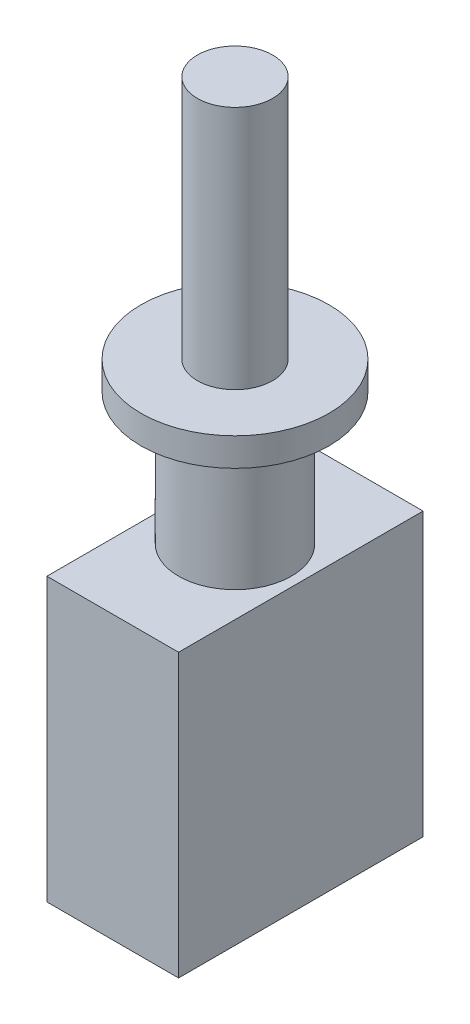
ISO-10303-21;
HEADER;
FILE_DESCRIPTION(('STEP AP214'),'2;1');
FILE_NAME('part.step','',(''),(''),'','','');
FILE_SCHEMA(('AUTOMOTIVE_DESIGN { 1 0 10303 214 1 1 1 1 }'));
ENDSEC;
DATA;
#1=APPLICATION_CONTEXT('core data for automotive mechanical design processes');
#2=APPLICATION_PROTOCOL_DEFINITION('international standard','automotive_design',2000,#1);
#3=PRODUCT_CONTEXT('',#1,'mechanical');
#4=PRODUCT('Part','Part','',(#3));
#5=PRODUCT_RELATED_PRODUCT_CATEGORY('part','',(#4));
#6=PRODUCT_DEFINITION_FORMATION('','',#4);
#7=PRODUCT_DEFINITION_CONTEXT('part definition',#1,'design');
#8=PRODUCT_DEFINITION('design','',#6,#7);
#9=PRODUCT_DEFINITION_SHAPE('','',#8);
#10=(LENGTH_UNIT() NAMED_UNIT(*) SI_UNIT(.MILLI.,.METRE.));
#11=(NAMED_UNIT(*) PLANE_ANGLE_UNIT() SI_UNIT($,.RADIAN.));
#12=(NAMED_UNIT(*) SI_UNIT($,.STERADIAN.) SOLID_ANGLE_UNIT());
#13=UNCERTAINTY_MEASURE_WITH_UNIT(LENGTH_MEASURE(1.E-05),#10,'distance_accuracy_value','');
#14=(GEOMETRIC_REPRESENTATION_CONTEXT(3) GLOBAL_UNCERTAINTY_ASSIGNED_CONTEXT((#13)) GLOBAL_UNIT_ASSIGNED_CONTEXT((#10,
#11,#12)) REPRESENTATION_CONTEXT('',''));
#15=CARTESIAN_POINT('',(0.,0.,0.));
#16=DIRECTION('',(0.,0.,1.));
#17=DIRECTION('',(1.,0.,0.));
#18=AXIS2_PLACEMENT_3D('',#15,#16,#17);
#19=CARTESIAN_POINT('',(0.,23.5,0.));
#20=DIRECTION('',(0.,1.,0.));
#21=DIRECTION('',(0.,0.,1.));
#22=AXIS2_PLACEMENT_3D('',#19,#20,#21);
#23=PLANE('',#22);
#24=CARTESIAN_POINT('',(0.,23.5,0.));
#25=DIRECTION('',(0.,1.,0.));
#26=DIRECTION('',(0.,0.,1.));
#27=AXIS2_PLACEMENT_3D('',#24,#25,#26);
#28=CIRCLE('',#27,5.);
#29=CARTESIAN_POINT('',(0.,23.5,5.));
#30=VERTEX_POINT('',#29);
#31=EDGE_CURVE('E151',#30,#30,#28,.T.);
#32=ORIENTED_EDGE('',*,*,#31,.T.);
#33=EDGE_LOOP('',(#32));
#34=FACE_BOUND('',#33,.T.);
#35=CARTESIAN_POINT('',(0.,23.5,0.));
#36=DIRECTION('',(0.,1.,0.));
#37=DIRECTION('',(0.,0.,1.));
#38=AXIS2_PLACEMENT_3D('',#35,#36,#37);
#39=CIRCLE('',#38,2.);
#40=CARTESIAN_POINT('',(0.,23.5,-2.));
#41=VERTEX_POINT('',#40);
#42=EDGE_CURVE('E159',#41,#41,#39,.T.);
#43=ORIENTED_EDGE('',*,*,#42,.F.);
#44=EDGE_LOOP('',(#43));
#45=FACE_BOUND('',#44,.T.);
#46=ADVANCED_FACE('F33',(#34,#45),#23,.T.);
#47=CARTESIAN_POINT('',(-3.5,15.,-6.5));
#48=DIRECTION('',(0.,-1.,0.));
#49=DIRECTION('',(0.,0.,-1.));
#50=AXIS2_PLACEMENT_3D('',#47,#48,#49);
#51=PLANE('',#50);
#52=DIRECTION('',(0.,0.,1.));
#53=VECTOR('',#52,1.);
#54=CARTESIAN_POINT('',(-3.5,15.,6.5));
#55=LINE('',#54,#53);
#56=CARTESIAN_POINT('',(-3.5,15.,-6.5));
#57=VERTEX_POINT('',#56);
#58=CARTESIAN_POINT('',(-3.5,15.,6.5));
#59=VERTEX_POINT('',#58);
#60=EDGE_CURVE('E87',#57,#59,#55,.T.);
#61=ORIENTED_EDGE('',*,*,#60,.T.);
#62=DIRECTION('',(1.,0.,0.));
#63=VECTOR('',#62,1.);
#64=CARTESIAN_POINT('',(-3.5,15.,6.5));
#65=LINE('',#64,#63);
#66=CARTESIAN_POINT('',(3.5,15.,6.5));
#67=VERTEX_POINT('',#66);
#68=EDGE_CURVE('E81',#59,#67,#65,.T.);
#69=ORIENTED_EDGE('',*,*,#68,.T.);
#70=DIRECTION('',(0.,0.,-1.));
#71=VECTOR('',#70,1.);
#72=CARTESIAN_POINT('',(3.5,15.,6.5));
#73=LINE('',#72,#71);
#74=CARTESIAN_POINT('',(3.5,15.,-6.5));
#75=VERTEX_POINT('',#74);
#76=EDGE_CURVE('E85',#67,#75,#73,.T.);
#77=ORIENTED_EDGE('',*,*,#76,.T.);
#78=DIRECTION('',(-1.,0.,0.));
#79=VECTOR('',#78,1.);
#80=CARTESIAN_POINT('',(-3.5,15.,-6.5));
#81=LINE('',#80,#79);
#82=EDGE_CURVE('E50',#75,#57,#81,.T.);
#83=ORIENTED_EDGE('',*,*,#82,.T.);
#84=EDGE_LOOP('',(#61,#69,#77,#83));
#85=FACE_BOUND('',#84,.T.);
#86=CARTESIAN_POINT('',(0.,15.,0.));
#87=DIRECTION('',(0.,-1.,0.));
#88=DIRECTION('',(0.,0.,-1.));
#89=AXIS2_PLACEMENT_3D('',#86,#87,#88);
#90=CIRCLE('',#89,3.);
#91=CARTESIAN_POINT('',(0.,15.,-3.));
#92=VERTEX_POINT('',#91);
#93=EDGE_CURVE('E11',#92,#92,#90,.F.);
#94=ORIENTED_EDGE('',*,*,#93,.F.);
#95=EDGE_LOOP('',(#94));
#96=FACE_BOUND('',#95,.T.);
#97=ADVANCED_FACE('F82',(#85,#96),#51,.F.);
#98=CARTESIAN_POINT('',(-3.5,15.,6.5));
#99=DIRECTION('',(1.,0.,0.));
#100=DIRECTION('',(0.,0.,-1.));
#101=AXIS2_PLACEMENT_3D('',#98,#99,#100);
#102=PLANE('',#101);
#103=DIRECTION('',(0.,0.,1.));
#104=VECTOR('',#103,1.);
#105=CARTESIAN_POINT('',(-3.5,0.,6.5));
#106=LINE('',#105,#104);
#107=CARTESIAN_POINT('',(-3.5,0.,-6.5));
#108=VERTEX_POINT('',#107);
#109=CARTESIAN_POINT('',(-3.5,0.,6.5));
#110=VERTEX_POINT('',#109);
#111=EDGE_CURVE('E101',#108,#110,#106,.T.);
#112=ORIENTED_EDGE('',*,*,#111,.T.);
#113=DIRECTION('',(0.,-1.,0.));
#114=VECTOR('',#113,1.);
#115=CARTESIAN_POINT('',(-3.5,15.,6.5));
#116=LINE('',#115,#114);
#117=EDGE_CURVE('E42',#59,#110,#116,.T.);
#118=ORIENTED_EDGE('',*,*,#117,.F.);
#119=ORIENTED_EDGE('',*,*,#60,.F.);
#120=DIRECTION('',(0.,-1.,0.));
#121=VECTOR('',#120,1.);
#122=CARTESIAN_POINT('',(-3.5,15.,-6.5));
#123=LINE('',#122,#121);
#124=EDGE_CURVE('E97',#57,#108,#123,.T.);
#125=ORIENTED_EDGE('',*,*,#124,.T.);
#126=EDGE_LOOP('',(#112,#118,#119,#125));
#127=FACE_BOUND('',#126,.T.);
#128=ADVANCED_FACE('F35',(#127),#102,.F.);
#129=CARTESIAN_POINT('',(-3.5,15.,6.5));
#130=DIRECTION('',(0.,0.,-1.));
#131=DIRECTION('',(-1.,0.,0.));
#132=AXIS2_PLACEMENT_3D('',#129,#130,#131);
#133=PLANE('',#132);
#134=DIRECTION('',(1.,0.,0.));
#135=VECTOR('',#134,1.);
#136=CARTESIAN_POINT('',(-3.5,0.,6.5));
#137=LINE('',#136,#135);
#138=CARTESIAN_POINT('',(3.5,0.,6.5));
#139=VERTEX_POINT('',#138);
#140=EDGE_CURVE('E92',#110,#139,#137,.T.);
#141=ORIENTED_EDGE('',*,*,#140,.T.);
#142=DIRECTION('',(0.,-1.,0.));
#143=VECTOR('',#142,1.);
#144=CARTESIAN_POINT('',(3.5,15.,6.5));
#145=LINE('',#144,#143);
#146=EDGE_CURVE('E90',#67,#139,#145,.T.);
#147=ORIENTED_EDGE('',*,*,#146,.F.);
#148=ORIENTED_EDGE('',*,*,#68,.F.);
#149=ORIENTED_EDGE('',*,*,#117,.T.);
#150=EDGE_LOOP('',(#141,#147,#148,#149));
#151=FACE_BOUND('',#150,.T.);
#152=ADVANCED_FACE('F91',(#151),#133,.F.);
#153=CARTESIAN_POINT('',(3.5,15.,6.5));
#154=DIRECTION('',(-1.,0.,0.));
#155=DIRECTION('',(0.,0.,1.));
#156=AXIS2_PLACEMENT_3D('',#153,#154,#155);
#157=PLANE('',#156);
#158=DIRECTION('',(0.,0.,-1.));
#159=VECTOR('',#158,1.);
#160=CARTESIAN_POINT('',(3.5,0.,6.5));
#161=LINE('',#160,#159);
#162=CARTESIAN_POINT('',(3.5,0.,-6.5));
#163=VERTEX_POINT('',#162);
#164=EDGE_CURVE('E67',#139,#163,#161,.T.);
#165=ORIENTED_EDGE('',*,*,#164,.T.);
#166=DIRECTION('',(0.,-1.,0.));
#167=VECTOR('',#166,1.);
#168=CARTESIAN_POINT('',(3.5,15.,-6.5));
#169=LINE('',#168,#167);
#170=EDGE_CURVE('E93',#75,#163,#169,.T.);
#171=ORIENTED_EDGE('',*,*,#170,.F.);
#172=ORIENTED_EDGE('',*,*,#76,.F.);
#173=ORIENTED_EDGE('',*,*,#146,.T.);
#174=EDGE_LOOP('',(#165,#171,#172,#173));
#175=FACE_BOUND('',#174,.T.);
#176=ADVANCED_FACE('F95',(#175),#157,.F.);
#177=CARTESIAN_POINT('',(-3.5,15.,-6.5));
#178=DIRECTION('',(0.,0.,1.));
#179=DIRECTION('',(1.,0.,0.));
#180=AXIS2_PLACEMENT_3D('',#177,#178,#179);
#181=PLANE('',#180);
#182=DIRECTION('',(-1.,0.,0.));
#183=VECTOR('',#182,1.);
#184=CARTESIAN_POINT('',(-3.5,0.,-6.5));
#185=LINE('',#184,#183);
#186=EDGE_CURVE('E73',#163,#108,#185,.T.);
#187=ORIENTED_EDGE('',*,*,#186,.T.);
#188=ORIENTED_EDGE('',*,*,#124,.F.);
#189=ORIENTED_EDGE('',*,*,#82,.F.);
#190=ORIENTED_EDGE('',*,*,#170,.T.);
#191=EDGE_LOOP('',(#187,#188,#189,#190));
#192=FACE_BOUND('',#191,.T.);
#193=ADVANCED_FACE('F115',(#192),#181,.F.);
#194=CARTESIAN_POINT('',(-3.5,0.,-6.5));
#195=DIRECTION('',(0.,-1.,0.));
#196=DIRECTION('',(0.,0.,-1.));
#197=AXIS2_PLACEMENT_3D('',#194,#195,#196);
#198=PLANE('',#197);
#199=ORIENTED_EDGE('',*,*,#111,.F.);
#200=ORIENTED_EDGE('',*,*,#186,.F.);
#201=ORIENTED_EDGE('',*,*,#164,.F.);
#202=ORIENTED_EDGE('',*,*,#140,.F.);
#203=EDGE_LOOP('',(#199,#200,#201,#202));
#204=FACE_BOUND('',#203,.T.);
#205=ADVANCED_FACE('F112',(#204),#198,.T.);
#206=CARTESIAN_POINT('',(0.,22.,0.));
#207=DIRECTION('',(0.,-1.,0.));
#208=DIRECTION('',(0.,0.,-1.));
#209=AXIS2_PLACEMENT_3D('',#206,#207,#208);
#210=CYLINDRICAL_SURFACE('',#209,3.);
#211=CARTESIAN_POINT('',(0.,22.,0.));
#212=DIRECTION('',(0.,1.,0.));
#213=DIRECTION('',(0.,0.,1.));
#214=AXIS2_PLACEMENT_3D('',#211,#212,#213);
#215=CIRCLE('',#214,3.);
#216=CARTESIAN_POINT('',(0.,22.,3.));
#217=VERTEX_POINT('',#216);
#218=EDGE_CURVE('E104',#217,#217,#215,.T.);
#219=ORIENTED_EDGE('',*,*,#218,.F.);
#220=EDGE_LOOP('',(#219));
#221=FACE_BOUND('',#220,.T.);
#222=ORIENTED_EDGE('',*,*,#93,.T.);
#223=EDGE_LOOP('',(#222));
#224=FACE_BOUND('',#223,.T.);
#225=ADVANCED_FACE('F114',(#221,#224),#210,.T.);
#226=CARTESIAN_POINT('',(0.,22.,0.));
#227=DIRECTION('',(0.,1.,0.));
#228=DIRECTION('',(0.,0.,1.));
#229=AXIS2_PLACEMENT_3D('',#226,#227,#228);
#230=PLANE('',#229);
#231=CARTESIAN_POINT('',(0.,22.,0.));
#232=DIRECTION('',(0.,1.,0.));
#233=DIRECTION('',(0.,0.,1.));
#234=AXIS2_PLACEMENT_3D('',#231,#232,#233);
#235=CIRCLE('',#234,5.);
#236=CARTESIAN_POINT('',(0.,22.,5.));
#237=VERTEX_POINT('',#236);
#238=EDGE_CURVE('E154',#237,#237,#235,.T.);
#239=ORIENTED_EDGE('',*,*,#238,.F.);
#240=EDGE_LOOP('',(#239));
#241=FACE_BOUND('',#240,.T.);
#242=ORIENTED_EDGE('',*,*,#218,.T.);
#243=EDGE_LOOP('',(#242));
#244=FACE_BOUND('',#243,.T.);
#245=ADVANCED_FACE('F121',(#241,#244),#230,.F.);
#246=CARTESIAN_POINT('',(0.,23.5,0.));
#247=DIRECTION('',(0.,-1.,0.));
#248=DIRECTION('',(0.,0.,-1.));
#249=AXIS2_PLACEMENT_3D('',#246,#247,#248);
#250=CYLINDRICAL_SURFACE('',#249,5.);
#251=ORIENTED_EDGE('',*,*,#31,.F.);
#252=EDGE_LOOP('',(#251));
#253=FACE_BOUND('',#252,.T.);
#254=ORIENTED_EDGE('',*,*,#238,.T.);
#255=EDGE_LOOP('',(#254));
#256=FACE_BOUND('',#255,.T.);
#257=ADVANCED_FACE('F140',(#253,#256),#250,.T.);
#258=CARTESIAN_POINT('',(0.,36.5,0.));
#259=DIRECTION('',(0.,-1.,0.));
#260=DIRECTION('',(0.,0.,-1.));
#261=AXIS2_PLACEMENT_3D('',#258,#259,#260);
#262=CYLINDRICAL_SURFACE('',#261,2.);
#263=CARTESIAN_POINT('',(0.,36.5,0.));
#264=DIRECTION('',(0.,1.,0.));
#265=DIRECTION('',(0.,0.,1.));
#266=AXIS2_PLACEMENT_3D('',#263,#264,#265);
#267=CIRCLE('',#266,2.);
#268=CARTESIAN_POINT('',(0.,36.5,-2.));
#269=VERTEX_POINT('',#268);
#270=EDGE_CURVE('E155',#269,#269,#267,.T.);
#271=CARTESIAN_POINT('',(0.,36.5,-2.));
#272=CARTESIAN_POINT('',(0.,36.3645833333333,-2.));
#273=CARTESIAN_POINT('',(0.,36.2291666666667,-2.));
#274=CARTESIAN_POINT('',(0.,35.9583333333333,-2.));
#275=CARTESIAN_POINT('',(0.,35.8229166666667,-2.));
#276=CARTESIAN_POINT('',(0.,35.5520833333333,-2.));
#277=CARTESIAN_POINT('',(0.,35.4166666666667,-2.));
#278=CARTESIAN_POINT('',(0.,35.1458333333333,-2.));
#279=CARTESIAN_POINT('',(0.,35.0104166666667,-2.));
#280=CARTESIAN_POINT('',(0.,34.7395833333333,-2.));
#281=CARTESIAN_POINT('',(0.,34.6041666666667,-2.));
#282=CARTESIAN_POINT('',(0.,34.3333333333333,-2.));
#283=CARTESIAN_POINT('',(0.,34.1979166666667,-2.));
#284=CARTESIAN_POINT('',(0.,33.9270833333333,-2.));
#285=CARTESIAN_POINT('',(0.,33.7916666666667,-2.));
#286=CARTESIAN_POINT('',(0.,33.5208333333333,-2.));
#287=CARTESIAN_POINT('',(0.,33.3854166666667,-2.));
#288=CARTESIAN_POINT('',(0.,33.1145833333333,-2.));
#289=CARTESIAN_POINT('',(0.,32.9791666666667,-2.));
#290=CARTESIAN_POINT('',(0.,32.7083333333333,-2.));
#291=CARTESIAN_POINT('',(0.,32.5729166666667,-2.));
#292=CARTESIAN_POINT('',(0.,32.3020833333333,-2.));
#293=CARTESIAN_POINT('',(0.,32.1666666666667,-2.));
#294=CARTESIAN_POINT('',(0.,31.8958333333333,-2.));
#295=CARTESIAN_POINT('',(0.,31.7604166666667,-2.));
#296=CARTESIAN_POINT('',(0.,31.4895833333333,-2.));
#297=CARTESIAN_POINT('',(0.,31.3541666666667,-2.));
#298=CARTESIAN_POINT('',(0.,31.0833333333333,-2.));
#299=CARTESIAN_POINT('',(0.,30.9479166666667,-2.));
#300=CARTESIAN_POINT('',(0.,30.6770833333333,-2.));
#301=CARTESIAN_POINT('',(0.,30.5416666666667,-2.));
#302=CARTESIAN_POINT('',(0.,30.2708333333333,-2.));
#303=CARTESIAN_POINT('',(0.,30.1354166666667,-2.));
#304=CARTESIAN_POINT('',(0.,29.8645833333333,-2.));
#305=CARTESIAN_POINT('',(0.,29.7291666666667,-2.));
#306=CARTESIAN_POINT('',(0.,29.4583333333333,-2.));
#307=CARTESIAN_POINT('',(0.,29.3229166666667,-2.));
#308=CARTESIAN_POINT('',(0.,29.0520833333333,-2.));
#309=CARTESIAN_POINT('',(0.,28.9166666666667,-2.));
#310=CARTESIAN_POINT('',(0.,28.6458333333333,-2.));
#311=CARTESIAN_POINT('',(0.,28.5104166666667,-2.));
#312=CARTESIAN_POINT('',(0.,28.2395833333333,-2.));
#313=CARTESIAN_POINT('',(0.,28.1041666666667,-2.));
#314=CARTESIAN_POINT('',(0.,27.8333333333333,-2.));
#315=CARTESIAN_POINT('',(0.,27.6979166666667,-2.));
#316=CARTESIAN_POINT('',(0.,27.4270833333333,-2.));
#317=CARTESIAN_POINT('',(0.,27.2916666666667,-2.));
#318=CARTESIAN_POINT('',(0.,27.0208333333333,-2.));
#319=CARTESIAN_POINT('',(0.,26.8854166666667,-2.));
#320=CARTESIAN_POINT('',(0.,26.6145833333333,-2.));
#321=CARTESIAN_POINT('',(0.,26.4791666666667,-2.));
#322=CARTESIAN_POINT('',(0.,26.2083333333333,-2.));
#323=CARTESIAN_POINT('',(0.,26.0729166666667,-2.));
#324=CARTESIAN_POINT('',(0.,25.8020833333333,-2.));
#325=CARTESIAN_POINT('',(0.,25.6666666666667,-2.));
#326=CARTESIAN_POINT('',(0.,25.3958333333333,-2.));
#327=CARTESIAN_POINT('',(0.,25.2604166666667,-2.));
#328=CARTESIAN_POINT('',(0.,24.9895833333333,-2.));
#329=CARTESIAN_POINT('',(0.,24.8541666666667,-2.));
#330=CARTESIAN_POINT('',(0.,24.5833333333333,-2.));
#331=CARTESIAN_POINT('',(0.,24.4479166666667,-2.));
#332=CARTESIAN_POINT('',(0.,24.1770833333333,-2.));
#333=CARTESIAN_POINT('',(0.,24.0416666666667,-2.));
#334=CARTESIAN_POINT('',(0.,23.7708333333333,-2.));
#335=CARTESIAN_POINT('',(0.,23.6354166666667,-2.));
#336=CARTESIAN_POINT('',(0.,23.5,-2.));
#337=B_SPLINE_CURVE_WITH_KNOTS('',3,(#271,#272,#273,#274,#275,#276,#277,#278,#279,#280,#281,
#282,#283,#284,#285,#286,#287,#288,#289,#290,#291,#292,#293,#294,#295,#296,#297,#298,#299,#300,
#301,#302,#303,#304,#305,#306,#307,#308,#309,#310,#311,#312,#313,#314,#315,#316,#317,#318,#319,
#320,#321,#322,#323,#324,#325,#326,#327,#328,#329,#330,#331,#332,#333,#334,#335,#336),
.UNSPECIFIED.,.F.,.F.,(4,2,2,2,2,2,2,2,2,2,2,2,2,2,2,2,2,2,2,2,2,2,2,2,2,2,2,2,2,2,2,2,4),(0.,
0.406249999999997,0.812499999999994,1.21875,1.62499999999999,2.03125,2.4375,2.84374999999999,
3.25,3.65624999999999,4.0625,4.46874999999999,4.875,5.28124999999999,5.68749999999999,
6.09374999999999,6.5,6.90625,7.31249999999999,7.71874999999999,8.12499999999999,
8.53124999999999,8.93749999999999,9.34374999999999,9.74999999999999,10.15625,10.5625,10.96875,
11.375,11.78125,12.1875,12.59375,13.),.UNSPECIFIED.);
#338=EDGE_CURVE('BSEAM136',#269,#41,#337,.T.);
#339=ORIENTED_EDGE('',*,*,#270,.F.);
#340=ORIENTED_EDGE('',*,*,#42,.T.);
#341=ORIENTED_EDGE('',*,*,#338,.T.);
#342=ORIENTED_EDGE('',*,*,#338,.F.);
#343=EDGE_LOOP('',(#339,#341,#340,#342));
#344=FACE_BOUND('',#343,.T.);
#345=ADVANCED_FACE('F136',(#344),#262,.T.);
#346=CARTESIAN_POINT('',(0.,36.5,0.));
#347=DIRECTION('',(0.,1.,0.));
#348=DIRECTION('',(0.,0.,1.));
#349=AXIS2_PLACEMENT_3D('',#346,#347,#348);
#350=PLANE('',#349);
#351=ORIENTED_EDGE('',*,*,#270,.T.);
#352=EDGE_LOOP('',(#351));
#353=FACE_BOUND('',#352,.T.);
#354=ADVANCED_FACE('F147',(#353),#350,.T.);
#355=CLOSED_SHELL('',(#46,#97,#128,#152,#176,#193,#205,#225,#245,#257,#345,#354));
#356=MANIFOLD_SOLID_BREP('B2',#355);
#357=ADVANCED_BREP_SHAPE_REPRESENTATION('',(#18,#356),#14);
#358=SHAPE_DEFINITION_REPRESENTATION(#9,#357);
ENDSEC;
END-ISO-10303-21;
